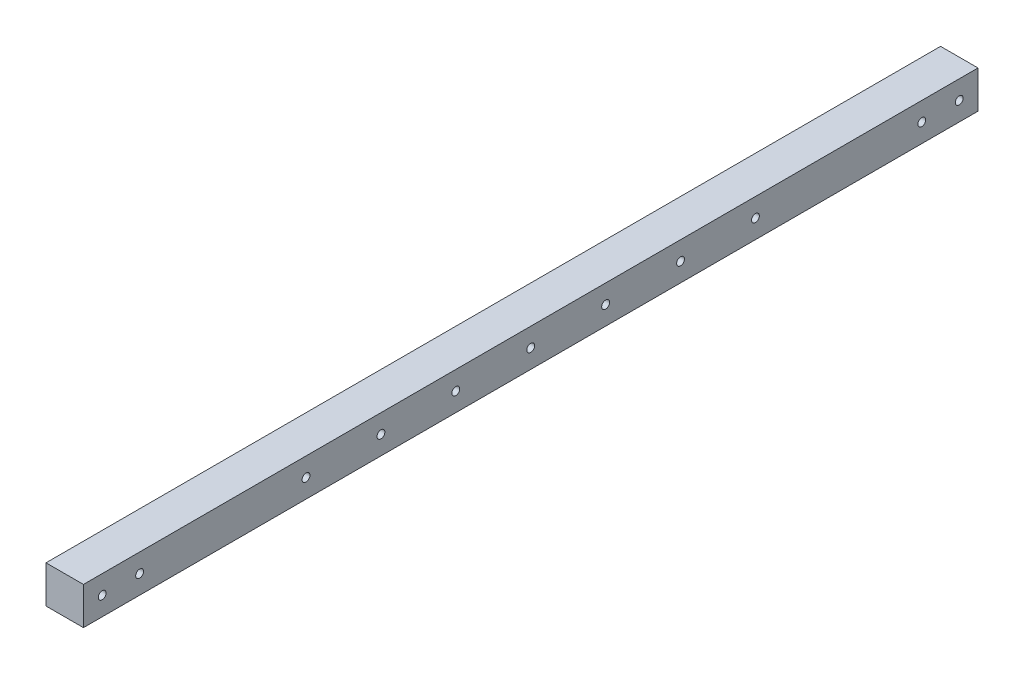
ISO-10303-21;
HEADER;
FILE_DESCRIPTION(('STEP AP214'),'2;1');
FILE_NAME('part.step','',(''),(''),'','','');
FILE_SCHEMA(('AUTOMOTIVE_DESIGN { 1 0 10303 214 1 1 1 1 }'));
ENDSEC;
DATA;
#1=APPLICATION_CONTEXT('core data for automotive mechanical design processes');
#2=APPLICATION_PROTOCOL_DEFINITION('international standard','automotive_design',2000,#1);
#3=PRODUCT_CONTEXT('',#1,'mechanical');
#4=PRODUCT('Part','Part','',(#3));
#5=PRODUCT_RELATED_PRODUCT_CATEGORY('part','',(#4));
#6=PRODUCT_DEFINITION_FORMATION('','',#4);
#7=PRODUCT_DEFINITION_CONTEXT('part definition',#1,'design');
#8=PRODUCT_DEFINITION('design','',#6,#7);
#9=PRODUCT_DEFINITION_SHAPE('','',#8);
#10=(LENGTH_UNIT() NAMED_UNIT(*) SI_UNIT(.MILLI.,.METRE.));
#11=(NAMED_UNIT(*) PLANE_ANGLE_UNIT() SI_UNIT($,.RADIAN.));
#12=(NAMED_UNIT(*) SI_UNIT($,.STERADIAN.) SOLID_ANGLE_UNIT());
#13=UNCERTAINTY_MEASURE_WITH_UNIT(LENGTH_MEASURE(1.E-05),#10,'distance_accuracy_value','');
#14=(GEOMETRIC_REPRESENTATION_CONTEXT(3) GLOBAL_UNCERTAINTY_ASSIGNED_CONTEXT((#13)) GLOBAL_UNIT_ASSIGNED_CONTEXT((#10,
#11,#12)) REPRESENTATION_CONTEXT('',''));
#15=CARTESIAN_POINT('',(0.,0.,0.));
#16=DIRECTION('',(0.,0.,1.));
#17=DIRECTION('',(1.,0.,0.));
#18=AXIS2_PLACEMENT_3D('',#15,#16,#17);
#19=CARTESIAN_POINT('',(10.,10.,477.69));
#20=DIRECTION('',(-1.,0.,0.));
#21=DIRECTION('',(0.,-1.,0.));
#22=AXIS2_PLACEMENT_3D('',#19,#20,#21);
#23=PLANE('',#22);
#24=CARTESIAN_POINT('',(10.,0.,358.845));
#25=DIRECTION('',(1.,0.,0.));
#26=DIRECTION('',(0.,-1.,0.));
#27=AXIS2_PLACEMENT_3D('',#24,#25,#26);
#28=CIRCLE('',#27,2.10000000000004);
#29=CARTESIAN_POINT('',(10.,-2.10000000000003,358.845));
#30=VERTEX_POINT('',#29);
#31=EDGE_CURVE('E194',#30,#30,#28,.T.);
#32=ORIENTED_EDGE('',*,*,#31,.F.);
#33=EDGE_LOOP('',(#32));
#34=FACE_BOUND('',#33,.T.);
#35=CARTESIAN_POINT('',(10.,0.,198.845));
#36=DIRECTION('',(1.,0.,0.));
#37=DIRECTION('',(0.,1.,0.));
#38=AXIS2_PLACEMENT_3D('',#35,#36,#37);
#39=CIRCLE('',#38,2.09999999999999);
#40=CARTESIAN_POINT('',(10.,2.10000000000001,198.845));
#41=VERTEX_POINT('',#40);
#42=EDGE_CURVE('E186',#41,#41,#39,.T.);
#43=ORIENTED_EDGE('',*,*,#42,.F.);
#44=EDGE_LOOP('',(#43));
#45=FACE_BOUND('',#44,.T.);
#46=CARTESIAN_POINT('',(10.,0.,158.845));
#47=DIRECTION('',(1.,0.,0.));
#48=DIRECTION('',(0.,1.,0.));
#49=AXIS2_PLACEMENT_3D('',#46,#47,#48);
#50=CIRCLE('',#49,2.09999999999999);
#51=CARTESIAN_POINT('',(10.,2.10000000000001,158.845));
#52=VERTEX_POINT('',#51);
#53=EDGE_CURVE('E178',#52,#52,#50,.T.);
#54=ORIENTED_EDGE('',*,*,#53,.F.);
#55=EDGE_LOOP('',(#54));
#56=FACE_BOUND('',#55,.T.);
#57=CARTESIAN_POINT('',(10.,0.,118.845));
#58=DIRECTION('',(1.,0.,0.));
#59=DIRECTION('',(0.,1.,0.));
#60=AXIS2_PLACEMENT_3D('',#57,#58,#59);
#61=CIRCLE('',#60,2.09999999999999);
#62=CARTESIAN_POINT('',(10.,2.10000000000001,118.845));
#63=VERTEX_POINT('',#62);
#64=EDGE_CURVE('E169',#63,#63,#61,.T.);
#65=ORIENTED_EDGE('',*,*,#64,.F.);
#66=EDGE_LOOP('',(#65));
#67=FACE_BOUND('',#66,.T.);
#68=CARTESIAN_POINT('',(10.,0.,318.845));
#69=DIRECTION('',(1.,0.,0.));
#70=DIRECTION('',(0.,-1.,0.));
#71=AXIS2_PLACEMENT_3D('',#68,#69,#70);
#72=CIRCLE('',#71,2.09999999999999);
#73=CARTESIAN_POINT('',(10.,-2.09999999999997,318.845));
#74=VERTEX_POINT('',#73);
#75=EDGE_CURVE('E209',#74,#74,#72,.T.);
#76=ORIENTED_EDGE('',*,*,#75,.F.);
#77=EDGE_LOOP('',(#76));
#78=FACE_BOUND('',#77,.T.);
#79=CARTESIAN_POINT('',(10.,0.,278.845));
#80=DIRECTION('',(1.,0.,0.));
#81=DIRECTION('',(0.,-1.,0.));
#82=AXIS2_PLACEMENT_3D('',#79,#80,#81);
#83=CIRCLE('',#82,2.09999999999999);
#84=CARTESIAN_POINT('',(10.,-2.09999999999997,278.845));
#85=VERTEX_POINT('',#84);
#86=EDGE_CURVE('E201',#85,#85,#83,.T.);
#87=ORIENTED_EDGE('',*,*,#86,.F.);
#88=EDGE_LOOP('',(#87));
#89=FACE_BOUND('',#88,.T.);
#90=CARTESIAN_POINT('',(10.,0.,238.845));
#91=DIRECTION('',(1.,0.,0.));
#92=DIRECTION('',(0.,1.,0.));
#93=AXIS2_PLACEMENT_3D('',#90,#91,#92);
#94=CIRCLE('',#93,2.09999999999999);
#95=CARTESIAN_POINT('',(10.,2.09999999999999,238.845));
#96=VERTEX_POINT('',#95);
#97=EDGE_CURVE('E161',#96,#96,#94,.T.);
#98=ORIENTED_EDGE('',*,*,#97,.F.);
#99=EDGE_LOOP('',(#98));
#100=FACE_BOUND('',#99,.T.);
#101=CARTESIAN_POINT('',(10.,0.,467.69));
#102=DIRECTION('',(1.,0.,0.));
#103=DIRECTION('',(0.,1.,0.));
#104=AXIS2_PLACEMENT_3D('',#101,#102,#103);
#105=CIRCLE('',#104,2.09999999999999);
#106=CARTESIAN_POINT('',(10.,2.09999999999999,467.69));
#107=VERTEX_POINT('',#106);
#108=EDGE_CURVE('E146',#107,#107,#105,.T.);
#109=ORIENTED_EDGE('',*,*,#108,.F.);
#110=EDGE_LOOP('',(#109));
#111=FACE_BOUND('',#110,.T.);
#112=CARTESIAN_POINT('',(10.,0.,30.));
#113=DIRECTION('',(1.,0.,0.));
#114=DIRECTION('',(0.,-1.,0.));
#115=AXIS2_PLACEMENT_3D('',#112,#113,#114);
#116=CIRCLE('',#115,2.09999999999999);
#117=CARTESIAN_POINT('',(10.,-2.09999999999999,30.));
#118=VERTEX_POINT('',#117);
#119=EDGE_CURVE('E147',#118,#118,#116,.T.);
#120=ORIENTED_EDGE('',*,*,#119,.F.);
#121=EDGE_LOOP('',(#120));
#122=FACE_BOUND('',#121,.T.);
#123=CARTESIAN_POINT('',(10.,0.,10.));
#124=DIRECTION('',(1.,0.,0.));
#125=DIRECTION('',(0.,-1.,0.));
#126=AXIS2_PLACEMENT_3D('',#123,#124,#125);
#127=CIRCLE('',#126,2.09999999999999);
#128=CARTESIAN_POINT('',(10.,-2.09999999999999,10.));
#129=VERTEX_POINT('',#128);
#130=EDGE_CURVE('E129',#129,#129,#127,.T.);
#131=ORIENTED_EDGE('',*,*,#130,.F.);
#132=EDGE_LOOP('',(#131));
#133=FACE_BOUND('',#132,.T.);
#134=CARTESIAN_POINT('',(10.,0.,447.69));
#135=DIRECTION('',(1.,0.,0.));
#136=DIRECTION('',(0.,1.,0.));
#137=AXIS2_PLACEMENT_3D('',#134,#135,#136);
#138=CIRCLE('',#137,2.09999999999999);
#139=CARTESIAN_POINT('',(10.,2.1,447.69));
#140=VERTEX_POINT('',#139);
#141=EDGE_CURVE('E138',#140,#140,#138,.T.);
#142=ORIENTED_EDGE('',*,*,#141,.F.);
#143=EDGE_LOOP('',(#142));
#144=FACE_BOUND('',#143,.T.);
#145=DIRECTION('',(0.,1.,0.));
#146=VECTOR('',#145,1.);
#147=CARTESIAN_POINT('',(10.,10.,0.));
#148=LINE('',#147,#146);
#149=CARTESIAN_POINT('',(10.,-10.,0.));
#150=VERTEX_POINT('',#149);
#151=CARTESIAN_POINT('',(10.,10.,0.));
#152=VERTEX_POINT('',#151);
#153=EDGE_CURVE('E108',#150,#152,#148,.T.);
#154=ORIENTED_EDGE('',*,*,#153,.T.);
#155=DIRECTION('',(0.,0.,-1.));
#156=VECTOR('',#155,1.);
#157=CARTESIAN_POINT('',(10.,10.,477.69));
#158=LINE('',#157,#156);
#159=CARTESIAN_POINT('',(10.,10.,477.69));
#160=VERTEX_POINT('',#159);
#161=EDGE_CURVE('E11',#160,#152,#158,.T.);
#162=ORIENTED_EDGE('',*,*,#161,.F.);
#163=DIRECTION('',(0.,1.,0.));
#164=VECTOR('',#163,1.);
#165=CARTESIAN_POINT('',(10.,10.,477.69));
#166=LINE('',#165,#164);
#167=CARTESIAN_POINT('',(10.,-10.,477.69));
#168=VERTEX_POINT('',#167);
#169=EDGE_CURVE('E92',#168,#160,#166,.T.);
#170=ORIENTED_EDGE('',*,*,#169,.F.);
#171=DIRECTION('',(0.,0.,-1.));
#172=VECTOR('',#171,1.);
#173=CARTESIAN_POINT('',(10.,-10.,477.69));
#174=LINE('',#173,#172);
#175=EDGE_CURVE('E104',#168,#150,#174,.T.);
#176=ORIENTED_EDGE('',*,*,#175,.T.);
#177=EDGE_LOOP('',(#154,#162,#170,#176));
#178=FACE_BOUND('',#177,.T.);
#179=ADVANCED_FACE('F40',(#34,#45,#56,#67,#78,#89,#100,#111,#122,#133,#144,#178),#23,.F.);
#180=CARTESIAN_POINT('',(-10.,10.,477.69));
#181=DIRECTION('',(0.,-1.,0.));
#182=DIRECTION('',(0.,0.,-1.));
#183=AXIS2_PLACEMENT_3D('',#180,#181,#182);
#184=PLANE('',#183);
#185=DIRECTION('',(-1.,0.,0.));
#186=VECTOR('',#185,1.);
#187=CARTESIAN_POINT('',(-10.,10.,0.));
#188=LINE('',#187,#186);
#189=CARTESIAN_POINT('',(-10.,10.,0.));
#190=VERTEX_POINT('',#189);
#191=EDGE_CURVE('E97',#152,#190,#188,.T.);
#192=ORIENTED_EDGE('',*,*,#191,.T.);
#193=DIRECTION('',(0.,0.,-1.));
#194=VECTOR('',#193,1.);
#195=CARTESIAN_POINT('',(-10.,10.,477.69));
#196=LINE('',#195,#194);
#197=CARTESIAN_POINT('',(-10.,10.,477.69));
#198=VERTEX_POINT('',#197);
#199=EDGE_CURVE('E49',#198,#190,#196,.T.);
#200=ORIENTED_EDGE('',*,*,#199,.F.);
#201=DIRECTION('',(-1.,0.,0.));
#202=VECTOR('',#201,1.);
#203=CARTESIAN_POINT('',(-10.,10.,477.69));
#204=LINE('',#203,#202);
#205=EDGE_CURVE('E87',#160,#198,#204,.T.);
#206=ORIENTED_EDGE('',*,*,#205,.F.);
#207=ORIENTED_EDGE('',*,*,#161,.T.);
#208=EDGE_LOOP('',(#192,#200,#206,#207));
#209=FACE_BOUND('',#208,.T.);
#210=ADVANCED_FACE('F96',(#209),#184,.F.);
#211=CARTESIAN_POINT('',(-10.,10.,477.69));
#212=DIRECTION('',(1.,0.,0.));
#213=DIRECTION('',(0.,1.,0.));
#214=AXIS2_PLACEMENT_3D('',#211,#212,#213);
#215=PLANE('',#214);
#216=CARTESIAN_POINT('',(-10.,0.,358.845));
#217=DIRECTION('',(1.,0.,0.));
#218=DIRECTION('',(0.,-1.,0.));
#219=AXIS2_PLACEMENT_3D('',#216,#217,#218);
#220=CIRCLE('',#219,2.10000000000004);
#221=CARTESIAN_POINT('',(-10.,-2.10000000000003,358.845));
#222=VERTEX_POINT('',#221);
#223=EDGE_CURVE('E165',#222,#222,#220,.T.);
#224=ORIENTED_EDGE('',*,*,#223,.T.);
#225=EDGE_LOOP('',(#224));
#226=FACE_BOUND('',#225,.T.);
#227=CARTESIAN_POINT('',(-10.,0.,198.845));
#228=DIRECTION('',(1.,0.,0.));
#229=DIRECTION('',(0.,1.,0.));
#230=AXIS2_PLACEMENT_3D('',#227,#228,#229);
#231=CIRCLE('',#230,2.09999999999999);
#232=CARTESIAN_POINT('',(-10.,2.1,198.845));
#233=VERTEX_POINT('',#232);
#234=EDGE_CURVE('E190',#233,#233,#231,.T.);
#235=ORIENTED_EDGE('',*,*,#234,.T.);
#236=EDGE_LOOP('',(#235));
#237=FACE_BOUND('',#236,.T.);
#238=CARTESIAN_POINT('',(-10.,0.,158.845));
#239=DIRECTION('',(1.,0.,0.));
#240=DIRECTION('',(0.,1.,0.));
#241=AXIS2_PLACEMENT_3D('',#238,#239,#240);
#242=CIRCLE('',#241,2.09999999999999);
#243=CARTESIAN_POINT('',(-10.,2.1,158.845));
#244=VERTEX_POINT('',#243);
#245=EDGE_CURVE('E182',#244,#244,#242,.T.);
#246=ORIENTED_EDGE('',*,*,#245,.T.);
#247=EDGE_LOOP('',(#246));
#248=FACE_BOUND('',#247,.T.);
#249=CARTESIAN_POINT('',(-10.,0.,118.845));
#250=DIRECTION('',(1.,0.,0.));
#251=DIRECTION('',(0.,1.,0.));
#252=AXIS2_PLACEMENT_3D('',#249,#250,#251);
#253=CIRCLE('',#252,2.09999999999999);
#254=CARTESIAN_POINT('',(-10.,2.1,118.845));
#255=VERTEX_POINT('',#254);
#256=EDGE_CURVE('E173',#255,#255,#253,.T.);
#257=ORIENTED_EDGE('',*,*,#256,.T.);
#258=EDGE_LOOP('',(#257));
#259=FACE_BOUND('',#258,.T.);
#260=CARTESIAN_POINT('',(-10.,0.,318.845));
#261=DIRECTION('',(1.,0.,0.));
#262=DIRECTION('',(0.,-1.,0.));
#263=AXIS2_PLACEMENT_3D('',#260,#261,#262);
#264=CIRCLE('',#263,2.09999999999999);
#265=CARTESIAN_POINT('',(-10.,-2.09999999999998,318.845));
#266=VERTEX_POINT('',#265);
#267=EDGE_CURVE('E174',#266,#266,#264,.T.);
#268=ORIENTED_EDGE('',*,*,#267,.T.);
#269=EDGE_LOOP('',(#268));
#270=FACE_BOUND('',#269,.T.);
#271=CARTESIAN_POINT('',(-10.,0.,278.845));
#272=DIRECTION('',(1.,0.,0.));
#273=DIRECTION('',(0.,-1.,0.));
#274=AXIS2_PLACEMENT_3D('',#271,#272,#273);
#275=CIRCLE('',#274,2.09999999999999);
#276=CARTESIAN_POINT('',(-10.,-2.09999999999998,278.845));
#277=VERTEX_POINT('',#276);
#278=EDGE_CURVE('E205',#277,#277,#275,.T.);
#279=ORIENTED_EDGE('',*,*,#278,.T.);
#280=EDGE_LOOP('',(#279));
#281=FACE_BOUND('',#280,.T.);
#282=CARTESIAN_POINT('',(-10.,0.,238.845));
#283=DIRECTION('',(1.,0.,0.));
#284=DIRECTION('',(0.,1.,0.));
#285=AXIS2_PLACEMENT_3D('',#282,#283,#284);
#286=CIRCLE('',#285,2.09999999999999);
#287=CARTESIAN_POINT('',(-10.,2.09999999999999,238.845));
#288=VERTEX_POINT('',#287);
#289=EDGE_CURVE('E151',#288,#288,#286,.T.);
#290=ORIENTED_EDGE('',*,*,#289,.T.);
#291=EDGE_LOOP('',(#290));
#292=FACE_BOUND('',#291,.T.);
#293=CARTESIAN_POINT('',(-10.,0.,467.69));
#294=DIRECTION('',(1.,0.,0.));
#295=DIRECTION('',(0.,1.,0.));
#296=AXIS2_PLACEMENT_3D('',#293,#294,#295);
#297=CIRCLE('',#296,2.09999999999999);
#298=CARTESIAN_POINT('',(-10.,2.09999999999999,467.69));
#299=VERTEX_POINT('',#298);
#300=EDGE_CURVE('E112',#299,#299,#297,.T.);
#301=ORIENTED_EDGE('',*,*,#300,.T.);
#302=EDGE_LOOP('',(#301));
#303=FACE_BOUND('',#302,.T.);
#304=CARTESIAN_POINT('',(-10.,0.,30.));
#305=DIRECTION('',(1.,0.,0.));
#306=DIRECTION('',(0.,-1.,0.));
#307=AXIS2_PLACEMENT_3D('',#304,#305,#306);
#308=CIRCLE('',#307,2.09999999999999);
#309=CARTESIAN_POINT('',(-10.,-2.09999999999999,30.));
#310=VERTEX_POINT('',#309);
#311=EDGE_CURVE('E134',#310,#310,#308,.T.);
#312=ORIENTED_EDGE('',*,*,#311,.T.);
#313=EDGE_LOOP('',(#312));
#314=FACE_BOUND('',#313,.T.);
#315=CARTESIAN_POINT('',(-10.,0.,10.));
#316=DIRECTION('',(1.,0.,0.));
#317=DIRECTION('',(0.,-1.,0.));
#318=AXIS2_PLACEMENT_3D('',#315,#316,#317);
#319=CIRCLE('',#318,2.09999999999999);
#320=CARTESIAN_POINT('',(-10.,-2.09999999999999,10.));
#321=VERTEX_POINT('',#320);
#322=EDGE_CURVE('E133',#321,#321,#319,.T.);
#323=ORIENTED_EDGE('',*,*,#322,.T.);
#324=EDGE_LOOP('',(#323));
#325=FACE_BOUND('',#324,.T.);
#326=CARTESIAN_POINT('',(-10.,0.,447.69));
#327=DIRECTION('',(1.,0.,0.));
#328=DIRECTION('',(0.,1.,0.));
#329=AXIS2_PLACEMENT_3D('',#326,#327,#328);
#330=CIRCLE('',#329,2.09999999999999);
#331=CARTESIAN_POINT('',(-10.,2.09999999999999,447.69));
#332=VERTEX_POINT('',#331);
#333=EDGE_CURVE('E142',#332,#332,#330,.T.);
#334=ORIENTED_EDGE('',*,*,#333,.T.);
#335=EDGE_LOOP('',(#334));
#336=FACE_BOUND('',#335,.T.);
#337=DIRECTION('',(0.,-1.,0.));
#338=VECTOR('',#337,1.);
#339=CARTESIAN_POINT('',(-10.,10.,0.));
#340=LINE('',#339,#338);
#341=CARTESIAN_POINT('',(-10.,-10.,0.));
#342=VERTEX_POINT('',#341);
#343=EDGE_CURVE('E74',#190,#342,#340,.T.);
#344=ORIENTED_EDGE('',*,*,#343,.T.);
#345=DIRECTION('',(0.,0.,-1.));
#346=VECTOR('',#345,1.);
#347=CARTESIAN_POINT('',(-10.,-10.,477.69));
#348=LINE('',#347,#346);
#349=CARTESIAN_POINT('',(-10.,-10.,477.69));
#350=VERTEX_POINT('',#349);
#351=EDGE_CURVE('E99',#350,#342,#348,.T.);
#352=ORIENTED_EDGE('',*,*,#351,.F.);
#353=DIRECTION('',(0.,-1.,0.));
#354=VECTOR('',#353,1.);
#355=CARTESIAN_POINT('',(-10.,10.,477.69));
#356=LINE('',#355,#354);
#357=EDGE_CURVE('E90',#198,#350,#356,.T.);
#358=ORIENTED_EDGE('',*,*,#357,.F.);
#359=ORIENTED_EDGE('',*,*,#199,.T.);
#360=EDGE_LOOP('',(#344,#352,#358,#359));
#361=FACE_BOUND('',#360,.T.);
#362=ADVANCED_FACE('F100',(#226,#237,#248,#259,#270,#281,#292,#303,#314,#325,#336,#361),#215,.F.);
#363=CARTESIAN_POINT('',(-10.,-10.,477.69));
#364=DIRECTION('',(0.,1.,0.));
#365=DIRECTION('',(0.,0.,1.));
#366=AXIS2_PLACEMENT_3D('',#363,#364,#365);
#367=PLANE('',#366);
#368=DIRECTION('',(1.,0.,0.));
#369=VECTOR('',#368,1.);
#370=CARTESIAN_POINT('',(-10.,-10.,0.));
#371=LINE('',#370,#369);
#372=EDGE_CURVE('E80',#342,#150,#371,.T.);
#373=ORIENTED_EDGE('',*,*,#372,.T.);
#374=ORIENTED_EDGE('',*,*,#175,.F.);
#375=DIRECTION('',(1.,0.,0.));
#376=VECTOR('',#375,1.);
#377=CARTESIAN_POINT('',(-10.,-10.,477.69));
#378=LINE('',#377,#376);
#379=EDGE_CURVE('E57',#350,#168,#378,.T.);
#380=ORIENTED_EDGE('',*,*,#379,.F.);
#381=ORIENTED_EDGE('',*,*,#351,.T.);
#382=EDGE_LOOP('',(#373,#374,#380,#381));
#383=FACE_BOUND('',#382,.T.);
#384=ADVANCED_FACE('F122',(#383),#367,.F.);
#385=CARTESIAN_POINT('',(0.,0.,477.69));
#386=DIRECTION('',(0.,0.,1.));
#387=DIRECTION('',(1.,0.,0.));
#388=AXIS2_PLACEMENT_3D('',#385,#386,#387);
#389=PLANE('',#388);
#390=ORIENTED_EDGE('',*,*,#169,.T.);
#391=ORIENTED_EDGE('',*,*,#205,.T.);
#392=ORIENTED_EDGE('',*,*,#357,.T.);
#393=ORIENTED_EDGE('',*,*,#379,.T.);
#394=EDGE_LOOP('',(#390,#391,#392,#393));
#395=FACE_BOUND('',#394,.T.);
#396=ADVANCED_FACE('F88',(#395),#389,.T.);
#397=CARTESIAN_POINT('',(0.,0.,0.));
#398=DIRECTION('',(0.,0.,1.));
#399=DIRECTION('',(1.,0.,0.));
#400=AXIS2_PLACEMENT_3D('',#397,#398,#399);
#401=PLANE('',#400);
#402=ORIENTED_EDGE('',*,*,#153,.F.);
#403=ORIENTED_EDGE('',*,*,#372,.F.);
#404=ORIENTED_EDGE('',*,*,#343,.F.);
#405=ORIENTED_EDGE('',*,*,#191,.F.);
#406=EDGE_LOOP('',(#402,#403,#404,#405));
#407=FACE_BOUND('',#406,.T.);
#408=ADVANCED_FACE('F125',(#407),#401,.F.);
#409=CARTESIAN_POINT('',(-10.,0.,447.69));
#410=DIRECTION('',(1.,0.,0.));
#411=DIRECTION('',(0.,1.,0.));
#412=AXIS2_PLACEMENT_3D('',#409,#410,#411);
#413=CYLINDRICAL_SURFACE('',#412,2.09999999999999);
#414=ORIENTED_EDGE('',*,*,#333,.F.);
#415=EDGE_LOOP('',(#414));
#416=FACE_BOUND('',#415,.T.);
#417=ORIENTED_EDGE('',*,*,#141,.T.);
#418=EDGE_LOOP('',(#417));
#419=FACE_BOUND('',#418,.T.);
#420=ADVANCED_FACE('F242',(#416,#419),#413,.F.);
#421=CARTESIAN_POINT('',(-10.,0.,10.));
#422=DIRECTION('',(1.,0.,0.));
#423=DIRECTION('',(0.,1.,0.));
#424=AXIS2_PLACEMENT_3D('',#421,#422,#423);
#425=CYLINDRICAL_SURFACE('',#424,2.09999999999999);
#426=ORIENTED_EDGE('',*,*,#322,.F.);
#427=EDGE_LOOP('',(#426));
#428=FACE_BOUND('',#427,.T.);
#429=ORIENTED_EDGE('',*,*,#130,.T.);
#430=EDGE_LOOP('',(#429));
#431=FACE_BOUND('',#430,.T.);
#432=ADVANCED_FACE('F244',(#428,#431),#425,.F.);
#433=CARTESIAN_POINT('',(-10.,0.,30.));
#434=DIRECTION('',(1.,0.,0.));
#435=DIRECTION('',(0.,1.,0.));
#436=AXIS2_PLACEMENT_3D('',#433,#434,#435);
#437=CYLINDRICAL_SURFACE('',#436,2.09999999999999);
#438=ORIENTED_EDGE('',*,*,#311,.F.);
#439=EDGE_LOOP('',(#438));
#440=FACE_BOUND('',#439,.T.);
#441=ORIENTED_EDGE('',*,*,#119,.T.);
#442=EDGE_LOOP('',(#441));
#443=FACE_BOUND('',#442,.T.);
#444=ADVANCED_FACE('F251',(#440,#443),#437,.F.);
#445=CARTESIAN_POINT('',(-10.,0.,467.69));
#446=DIRECTION('',(1.,0.,0.));
#447=DIRECTION('',(0.,1.,0.));
#448=AXIS2_PLACEMENT_3D('',#445,#446,#447);
#449=CYLINDRICAL_SURFACE('',#448,2.09999999999999);
#450=ORIENTED_EDGE('',*,*,#300,.F.);
#451=EDGE_LOOP('',(#450));
#452=FACE_BOUND('',#451,.T.);
#453=ORIENTED_EDGE('',*,*,#108,.T.);
#454=EDGE_LOOP('',(#453));
#455=FACE_BOUND('',#454,.T.);
#456=ADVANCED_FACE('F309',(#452,#455),#449,.F.);
#457=CARTESIAN_POINT('',(-10.,0.,238.845));
#458=DIRECTION('',(1.,0.,0.));
#459=DIRECTION('',(0.,1.,0.));
#460=AXIS2_PLACEMENT_3D('',#457,#458,#459);
#461=CYLINDRICAL_SURFACE('',#460,2.09999999999999);
#462=ORIENTED_EDGE('',*,*,#289,.F.);
#463=EDGE_LOOP('',(#462));
#464=FACE_BOUND('',#463,.T.);
#465=ORIENTED_EDGE('',*,*,#97,.T.);
#466=EDGE_LOOP('',(#465));
#467=FACE_BOUND('',#466,.T.);
#468=ADVANCED_FACE('F317',(#464,#467),#461,.F.);
#469=CARTESIAN_POINT('',(-10.,0.,278.845));
#470=DIRECTION('',(1.,0.,0.));
#471=DIRECTION('',(0.,1.,0.));
#472=AXIS2_PLACEMENT_3D('',#469,#470,#471);
#473=CYLINDRICAL_SURFACE('',#472,2.09999999999999);
#474=ORIENTED_EDGE('',*,*,#278,.F.);
#475=EDGE_LOOP('',(#474));
#476=FACE_BOUND('',#475,.T.);
#477=ORIENTED_EDGE('',*,*,#86,.T.);
#478=EDGE_LOOP('',(#477));
#479=FACE_BOUND('',#478,.T.);
#480=ADVANCED_FACE('F223',(#476,#479),#473,.F.);
#481=CARTESIAN_POINT('',(-10.,0.,318.845));
#482=DIRECTION('',(1.,0.,0.));
#483=DIRECTION('',(0.,1.,0.));
#484=AXIS2_PLACEMENT_3D('',#481,#482,#483);
#485=CYLINDRICAL_SURFACE('',#484,2.09999999999999);
#486=ORIENTED_EDGE('',*,*,#267,.F.);
#487=EDGE_LOOP('',(#486));
#488=FACE_BOUND('',#487,.T.);
#489=ORIENTED_EDGE('',*,*,#75,.T.);
#490=EDGE_LOOP('',(#489));
#491=FACE_BOUND('',#490,.T.);
#492=ADVANCED_FACE('F219',(#488,#491),#485,.F.);
#493=CARTESIAN_POINT('',(-10.,0.,118.845));
#494=DIRECTION('',(1.,0.,0.));
#495=DIRECTION('',(0.,1.,0.));
#496=AXIS2_PLACEMENT_3D('',#493,#494,#495);
#497=CYLINDRICAL_SURFACE('',#496,2.09999999999999);
#498=ORIENTED_EDGE('',*,*,#256,.F.);
#499=EDGE_LOOP('',(#498));
#500=FACE_BOUND('',#499,.T.);
#501=ORIENTED_EDGE('',*,*,#64,.T.);
#502=EDGE_LOOP('',(#501));
#503=FACE_BOUND('',#502,.T.);
#504=ADVANCED_FACE('F222',(#500,#503),#497,.F.);
#505=CARTESIAN_POINT('',(-10.,0.,158.845));
#506=DIRECTION('',(1.,0.,0.));
#507=DIRECTION('',(0.,1.,0.));
#508=AXIS2_PLACEMENT_3D('',#505,#506,#507);
#509=CYLINDRICAL_SURFACE('',#508,2.09999999999999);
#510=ORIENTED_EDGE('',*,*,#245,.F.);
#511=EDGE_LOOP('',(#510));
#512=FACE_BOUND('',#511,.T.);
#513=ORIENTED_EDGE('',*,*,#53,.T.);
#514=EDGE_LOOP('',(#513));
#515=FACE_BOUND('',#514,.T.);
#516=ADVANCED_FACE('F344',(#512,#515),#509,.F.);
#517=CARTESIAN_POINT('',(-10.,0.,198.845));
#518=DIRECTION('',(1.,0.,0.));
#519=DIRECTION('',(0.,1.,0.));
#520=AXIS2_PLACEMENT_3D('',#517,#518,#519);
#521=CYLINDRICAL_SURFACE('',#520,2.09999999999999);
#522=ORIENTED_EDGE('',*,*,#234,.F.);
#523=EDGE_LOOP('',(#522));
#524=FACE_BOUND('',#523,.T.);
#525=ORIENTED_EDGE('',*,*,#42,.T.);
#526=EDGE_LOOP('',(#525));
#527=FACE_BOUND('',#526,.T.);
#528=ADVANCED_FACE('F352',(#524,#527),#521,.F.);
#529=CARTESIAN_POINT('',(-10.,0.,358.845));
#530=DIRECTION('',(1.,0.,0.));
#531=DIRECTION('',(0.,1.,0.));
#532=AXIS2_PLACEMENT_3D('',#529,#530,#531);
#533=CYLINDRICAL_SURFACE('',#532,2.10000000000004);
#534=ORIENTED_EDGE('',*,*,#223,.F.);
#535=EDGE_LOOP('',(#534));
#536=FACE_BOUND('',#535,.T.);
#537=ORIENTED_EDGE('',*,*,#31,.T.);
#538=EDGE_LOOP('',(#537));
#539=FACE_BOUND('',#538,.T.);
#540=ADVANCED_FACE('F360',(#536,#539),#533,.F.);
#541=CLOSED_SHELL('',(#179,#210,#362,#384,#396,#408,#420,#432,#444,#456,#468,#480,#492,#504,
#516,#528,#540));
#542=MANIFOLD_SOLID_BREP('B2',#541);
#543=ADVANCED_BREP_SHAPE_REPRESENTATION('',(#18,#542),#14);
#544=SHAPE_DEFINITION_REPRESENTATION(#9,#543);
ENDSEC;
END-ISO-10303-21;
